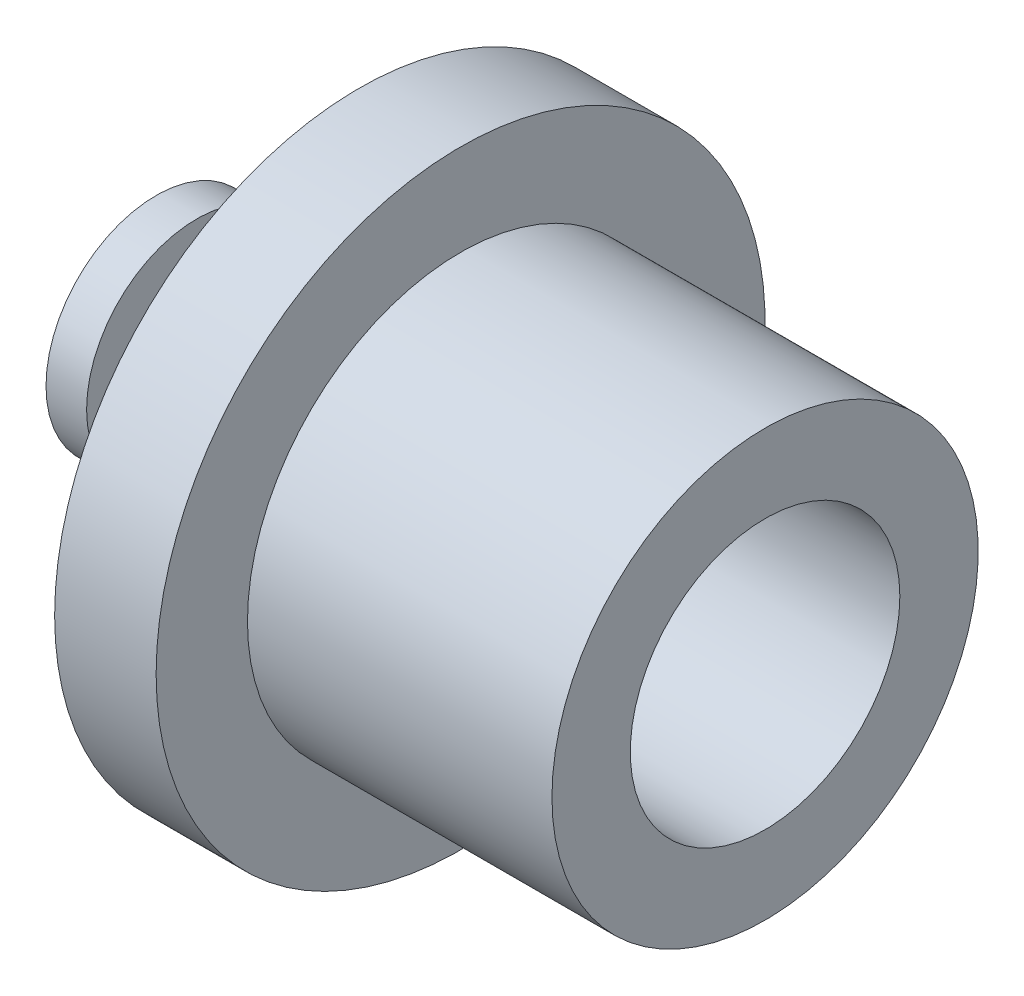
ISO-10303-21;
HEADER;
FILE_DESCRIPTION(('STEP AP214'),'2;1');
FILE_NAME('part.step','',(''),(''),'','','');
FILE_SCHEMA(('AUTOMOTIVE_DESIGN { 1 0 10303 214 1 1 1 1 }'));
ENDSEC;
DATA;
#1=APPLICATION_CONTEXT('core data for automotive mechanical design processes');
#2=APPLICATION_PROTOCOL_DEFINITION('international standard','automotive_design',2000,#1);
#3=PRODUCT_CONTEXT('',#1,'mechanical');
#4=PRODUCT('Part','Part','',(#3));
#5=PRODUCT_RELATED_PRODUCT_CATEGORY('part','',(#4));
#6=PRODUCT_DEFINITION_FORMATION('','',#4);
#7=PRODUCT_DEFINITION_CONTEXT('part definition',#1,'design');
#8=PRODUCT_DEFINITION('design','',#6,#7);
#9=PRODUCT_DEFINITION_SHAPE('','',#8);
#10=(LENGTH_UNIT() NAMED_UNIT(*) SI_UNIT(.MILLI.,.METRE.));
#11=(NAMED_UNIT(*) PLANE_ANGLE_UNIT() SI_UNIT($,.RADIAN.));
#12=(NAMED_UNIT(*) SI_UNIT($,.STERADIAN.) SOLID_ANGLE_UNIT());
#13=UNCERTAINTY_MEASURE_WITH_UNIT(LENGTH_MEASURE(1.E-05),#10,'distance_accuracy_value','');
#14=(GEOMETRIC_REPRESENTATION_CONTEXT(3) GLOBAL_UNCERTAINTY_ASSIGNED_CONTEXT((#13)) GLOBAL_UNIT_ASSIGNED_CONTEXT((#10,
#11,#12)) REPRESENTATION_CONTEXT('',''));
#15=CARTESIAN_POINT('',(0.,0.,0.));
#16=DIRECTION('',(0.,0.,1.));
#17=DIRECTION('',(1.,0.,0.));
#18=AXIS2_PLACEMENT_3D('',#15,#16,#17);
#19=CARTESIAN_POINT('',(1.27,3.444875,0.));
#20=DIRECTION('',(-1.,0.,0.));
#21=DIRECTION('',(0.,0.,1.));
#22=AXIS2_PLACEMENT_3D('',#19,#20,#21);
#23=PLANE('',#22);
#24=CARTESIAN_POINT('',(1.27,0.,0.));
#25=DIRECTION('',(-1.,0.,0.));
#26=DIRECTION('',(0.,0.,1.));
#27=AXIS2_PLACEMENT_3D('',#24,#25,#26);
#28=CIRCLE('',#27,3.444875);
#29=CARTESIAN_POINT('',(1.27,0.,3.444875));
#30=VERTEX_POINT('',#29);
#31=EDGE_CURVE('E10',#30,#30,#28,.T.);
#32=ORIENTED_EDGE('',*,*,#31,.F.);
#33=EDGE_LOOP('',(#32));
#34=FACE_BOUND('',#33,.T.);
#35=CARTESIAN_POINT('',(1.27,0.,0.));
#36=DIRECTION('',(-1.,0.,0.));
#37=DIRECTION('',(0.,0.,1.));
#38=AXIS2_PLACEMENT_3D('',#35,#36,#37);
#39=CIRCLE('',#38,2.073275);
#40=CARTESIAN_POINT('',(1.27,0.,2.073275));
#41=VERTEX_POINT('',#40);
#42=EDGE_CURVE('E73',#41,#41,#39,.T.);
#43=ORIENTED_EDGE('',*,*,#42,.T.);
#44=EDGE_LOOP('',(#43));
#45=FACE_BOUND('',#44,.T.);
#46=ADVANCED_FACE('F39',(#34,#45),#23,.F.);
#47=CARTESIAN_POINT('',(0.,0.,0.));
#48=DIRECTION('',(-1.,0.,0.));
#49=DIRECTION('',(0.,0.,1.));
#50=AXIS2_PLACEMENT_3D('',#47,#48,#49);
#51=CYLINDRICAL_SURFACE('',#50,3.444875);
#52=CARTESIAN_POINT('',(0.,0.,0.));
#53=DIRECTION('',(-1.,0.,0.));
#54=DIRECTION('',(0.,0.,1.));
#55=AXIS2_PLACEMENT_3D('',#52,#53,#54);
#56=CIRCLE('',#55,3.444875);
#57=CARTESIAN_POINT('',(0.,0.,3.444875));
#58=VERTEX_POINT('',#57);
#59=EDGE_CURVE('E46',#58,#58,#56,.T.);
#60=ORIENTED_EDGE('',*,*,#59,.F.);
#61=EDGE_LOOP('',(#60));
#62=FACE_BOUND('',#61,.T.);
#63=ORIENTED_EDGE('',*,*,#31,.T.);
#64=EDGE_LOOP('',(#63));
#65=FACE_BOUND('',#64,.T.);
#66=ADVANCED_FACE('F103',(#62,#65),#51,.T.);
#67=CARTESIAN_POINT('',(0.,0.,0.));
#68=DIRECTION('',(1.,0.,0.));
#69=DIRECTION('',(0.,0.,-1.));
#70=AXIS2_PLACEMENT_3D('',#67,#68,#69);
#71=PLANE('',#70);
#72=CARTESIAN_POINT('',(0.,0.,0.));
#73=DIRECTION('',(-1.,0.,0.));
#74=DIRECTION('',(0.,0.,1.));
#75=AXIS2_PLACEMENT_3D('',#72,#73,#74);
#76=CIRCLE('',#75,1.19062499999999);
#77=CARTESIAN_POINT('',(0.,0.,1.19062499999999));
#78=VERTEX_POINT('',#77);
#79=EDGE_CURVE('E82',#78,#78,#76,.T.);
#80=ORIENTED_EDGE('',*,*,#79,.F.);
#81=EDGE_LOOP('',(#80));
#82=FACE_BOUND('',#81,.T.);
#83=ORIENTED_EDGE('',*,*,#59,.T.);
#84=EDGE_LOOP('',(#83));
#85=FACE_BOUND('',#84,.T.);
#86=ADVANCED_FACE('F108',(#82,#85),#71,.F.);
#87=CARTESIAN_POINT('',(19.05,6.6675,0.));
#88=DIRECTION('',(-1.,0.,0.));
#89=DIRECTION('',(0.,0.,1.));
#90=AXIS2_PLACEMENT_3D('',#87,#88,#89);
#91=PLANE('',#90);
#92=CARTESIAN_POINT('',(19.05,0.,0.));
#93=DIRECTION('',(1.,0.,0.));
#94=DIRECTION('',(0.,0.,-1.));
#95=AXIS2_PLACEMENT_3D('',#92,#93,#94);
#96=CIRCLE('',#95,4.21639999999999);
#97=CARTESIAN_POINT('',(19.05,0.,-4.21639999999999));
#98=VERTEX_POINT('',#97);
#99=EDGE_CURVE('E79',#98,#98,#96,.T.);
#100=ORIENTED_EDGE('',*,*,#99,.F.);
#101=EDGE_LOOP('',(#100));
#102=FACE_BOUND('',#101,.T.);
#103=CARTESIAN_POINT('',(19.05,0.,0.));
#104=DIRECTION('',(-1.,0.,0.));
#105=DIRECTION('',(0.,0.,1.));
#106=AXIS2_PLACEMENT_3D('',#103,#104,#105);
#107=CIRCLE('',#106,6.6675);
#108=CARTESIAN_POINT('',(19.05,0.,6.6675));
#109=VERTEX_POINT('',#108);
#110=EDGE_CURVE('E50',#109,#109,#107,.T.);
#111=ORIENTED_EDGE('',*,*,#110,.F.);
#112=EDGE_LOOP('',(#111));
#113=FACE_BOUND('',#112,.T.);
#114=ADVANCED_FACE('F152',(#102,#113),#91,.F.);
#115=CARTESIAN_POINT('',(0.,0.,0.));
#116=DIRECTION('',(-1.,0.,0.));
#117=DIRECTION('',(0.,0.,1.));
#118=AXIS2_PLACEMENT_3D('',#115,#116,#117);
#119=CYLINDRICAL_SURFACE('',#118,6.6675);
#120=CARTESIAN_POINT('',(9.525,0.,0.));
#121=DIRECTION('',(-1.,0.,0.));
#122=DIRECTION('',(0.,0.,1.));
#123=AXIS2_PLACEMENT_3D('',#120,#121,#122);
#124=CIRCLE('',#123,6.6675);
#125=CARTESIAN_POINT('',(9.525,0.,6.6675));
#126=VERTEX_POINT('',#125);
#127=EDGE_CURVE('E55',#126,#126,#124,.T.);
#128=ORIENTED_EDGE('',*,*,#127,.F.);
#129=EDGE_LOOP('',(#128));
#130=FACE_BOUND('',#129,.T.);
#131=ORIENTED_EDGE('',*,*,#110,.T.);
#132=EDGE_LOOP('',(#131));
#133=FACE_BOUND('',#132,.T.);
#134=ADVANCED_FACE('F146',(#130,#133),#119,.T.);
#135=CARTESIAN_POINT('',(9.525,9.525,0.));
#136=DIRECTION('',(-1.,0.,0.));
#137=DIRECTION('',(0.,0.,1.));
#138=AXIS2_PLACEMENT_3D('',#135,#136,#137);
#139=PLANE('',#138);
#140=CARTESIAN_POINT('',(9.525,0.,0.));
#141=DIRECTION('',(-1.,0.,0.));
#142=DIRECTION('',(0.,0.,1.));
#143=AXIS2_PLACEMENT_3D('',#140,#141,#142);
#144=CIRCLE('',#143,9.525);
#145=CARTESIAN_POINT('',(9.525,0.,9.525));
#146=VERTEX_POINT('',#145);
#147=EDGE_CURVE('E58',#146,#146,#144,.T.);
#148=ORIENTED_EDGE('',*,*,#147,.F.);
#149=EDGE_LOOP('',(#148));
#150=FACE_BOUND('',#149,.T.);
#151=ORIENTED_EDGE('',*,*,#127,.T.);
#152=EDGE_LOOP('',(#151));
#153=FACE_BOUND('',#152,.T.);
#154=ADVANCED_FACE('F140',(#150,#153),#139,.F.);
#155=CARTESIAN_POINT('',(0.,0.,0.));
#156=DIRECTION('',(-1.,0.,0.));
#157=DIRECTION('',(0.,0.,1.));
#158=AXIS2_PLACEMENT_3D('',#155,#156,#157);
#159=CYLINDRICAL_SURFACE('',#158,9.525);
#160=CARTESIAN_POINT('',(6.35,0.,0.));
#161=DIRECTION('',(-1.,0.,0.));
#162=DIRECTION('',(0.,0.,1.));
#163=AXIS2_PLACEMENT_3D('',#160,#161,#162);
#164=CIRCLE('',#163,9.525);
#165=CARTESIAN_POINT('',(6.35,0.,9.525));
#166=VERTEX_POINT('',#165);
#167=EDGE_CURVE('E61',#166,#166,#164,.T.);
#168=ORIENTED_EDGE('',*,*,#167,.F.);
#169=EDGE_LOOP('',(#168));
#170=FACE_BOUND('',#169,.T.);
#171=ORIENTED_EDGE('',*,*,#147,.T.);
#172=EDGE_LOOP('',(#171));
#173=FACE_BOUND('',#172,.T.);
#174=ADVANCED_FACE('F134',(#170,#173),#159,.T.);
#175=CARTESIAN_POINT('',(6.35,3.444875,0.));
#176=DIRECTION('',(1.,0.,0.));
#177=DIRECTION('',(0.,0.,-1.));
#178=AXIS2_PLACEMENT_3D('',#175,#176,#177);
#179=PLANE('',#178);
#180=CARTESIAN_POINT('',(6.35,0.,0.));
#181=DIRECTION('',(-1.,0.,0.));
#182=DIRECTION('',(0.,0.,1.));
#183=AXIS2_PLACEMENT_3D('',#180,#181,#182);
#184=CIRCLE('',#183,3.444875);
#185=CARTESIAN_POINT('',(6.35,0.,3.444875));
#186=VERTEX_POINT('',#185);
#187=EDGE_CURVE('E64',#186,#186,#184,.T.);
#188=ORIENTED_EDGE('',*,*,#187,.F.);
#189=EDGE_LOOP('',(#188));
#190=FACE_BOUND('',#189,.T.);
#191=ORIENTED_EDGE('',*,*,#167,.T.);
#192=EDGE_LOOP('',(#191));
#193=FACE_BOUND('',#192,.T.);
#194=ADVANCED_FACE('F128',(#190,#193),#179,.F.);
#195=CARTESIAN_POINT('',(0.,0.,0.));
#196=DIRECTION('',(-1.,0.,0.));
#197=DIRECTION('',(0.,0.,1.));
#198=AXIS2_PLACEMENT_3D('',#195,#196,#197);
#199=CYLINDRICAL_SURFACE('',#198,3.444875);
#200=CARTESIAN_POINT('',(3.81,0.,0.));
#201=DIRECTION('',(-1.,0.,0.));
#202=DIRECTION('',(0.,0.,1.));
#203=AXIS2_PLACEMENT_3D('',#200,#201,#202);
#204=CIRCLE('',#203,3.444875);
#205=CARTESIAN_POINT('',(3.81,0.,3.444875));
#206=VERTEX_POINT('',#205);
#207=EDGE_CURVE('E67',#206,#206,#204,.T.);
#208=ORIENTED_EDGE('',*,*,#207,.F.);
#209=EDGE_LOOP('',(#208));
#210=FACE_BOUND('',#209,.T.);
#211=ORIENTED_EDGE('',*,*,#187,.T.);
#212=EDGE_LOOP('',(#211));
#213=FACE_BOUND('',#212,.T.);
#214=ADVANCED_FACE('F122',(#210,#213),#199,.T.);
#215=CARTESIAN_POINT('',(3.81,3.444875,0.));
#216=DIRECTION('',(1.,0.,0.));
#217=DIRECTION('',(0.,0.,-1.));
#218=AXIS2_PLACEMENT_3D('',#215,#216,#217);
#219=PLANE('',#218);
#220=CARTESIAN_POINT('',(3.81,0.,0.));
#221=DIRECTION('',(-1.,0.,0.));
#222=DIRECTION('',(0.,0.,1.));
#223=AXIS2_PLACEMENT_3D('',#220,#221,#222);
#224=CIRCLE('',#223,2.073275);
#225=CARTESIAN_POINT('',(3.81,0.,2.073275));
#226=VERTEX_POINT('',#225);
#227=EDGE_CURVE('E70',#226,#226,#224,.T.);
#228=ORIENTED_EDGE('',*,*,#227,.F.);
#229=EDGE_LOOP('',(#228));
#230=FACE_BOUND('',#229,.T.);
#231=ORIENTED_EDGE('',*,*,#207,.T.);
#232=EDGE_LOOP('',(#231));
#233=FACE_BOUND('',#232,.T.);
#234=ADVANCED_FACE('F116',(#230,#233),#219,.F.);
#235=CARTESIAN_POINT('',(0.,0.,0.));
#236=DIRECTION('',(-1.,0.,0.));
#237=DIRECTION('',(0.,0.,1.));
#238=AXIS2_PLACEMENT_3D('',#235,#236,#237);
#239=CYLINDRICAL_SURFACE('',#238,2.073275);
#240=ORIENTED_EDGE('',*,*,#42,.F.);
#241=EDGE_LOOP('',(#240));
#242=FACE_BOUND('',#241,.T.);
#243=ORIENTED_EDGE('',*,*,#227,.T.);
#244=EDGE_LOOP('',(#243));
#245=FACE_BOUND('',#244,.T.);
#246=ADVANCED_FACE('F113',(#242,#245),#239,.T.);
#247=CARTESIAN_POINT('',(9.525,0.,0.));
#248=DIRECTION('',(1.,0.,0.));
#249=DIRECTION('',(0.,0.,-1.));
#250=AXIS2_PLACEMENT_3D('',#247,#248,#249);
#251=CONICAL_SURFACE('',#250,4.2164,1.02974425867665);
#252=CARTESIAN_POINT('',(7.70693096046188,0.,0.));
#253=DIRECTION('',(1.,0.,0.));
#254=DIRECTION('',(0.,0.,-1.));
#255=AXIS2_PLACEMENT_3D('',#252,#253,#254);
#256=CIRCLE('',#255,1.19062499999999);
#257=CARTESIAN_POINT('',(7.70693096046188,0.,-1.19062499999999));
#258=VERTEX_POINT('',#257);
#259=EDGE_CURVE('E42',#258,#258,#256,.F.);
#260=CARTESIAN_POINT('',(9.525,0.,0.));
#261=DIRECTION('',(1.,0.,0.));
#262=DIRECTION('',(0.,0.,-1.));
#263=AXIS2_PLACEMENT_3D('',#260,#261,#262);
#264=CIRCLE('',#263,4.2164);
#265=CARTESIAN_POINT('',(9.525,0.,-4.21639999999999));
#266=VERTEX_POINT('',#265);
#267=EDGE_CURVE('E76',#266,#266,#264,.T.);
#268=CARTESIAN_POINT('',(7.70693096046188,0.,-1.19062499999999));
#269=CARTESIAN_POINT('',(7.72586917962373,0.,-1.22214348958332));
#270=CARTESIAN_POINT('',(7.74480739878559,0.,-1.25366197916666));
#271=CARTESIAN_POINT('',(7.7826838371093,0.,-1.31669895833332));
#272=CARTESIAN_POINT('',(7.80162205627115,0.,-1.34821744791666));
#273=CARTESIAN_POINT('',(7.83949849459486,0.,-1.41125442708332));
#274=CARTESIAN_POINT('',(7.85843671375672,0.,-1.44277291666666));
#275=CARTESIAN_POINT('',(7.89631315208043,0.,-1.50580989583332));
#276=CARTESIAN_POINT('',(7.91525137124229,0.,-1.53732838541666));
#277=CARTESIAN_POINT('',(7.953127809566,0.,-1.60036536458332));
#278=CARTESIAN_POINT('',(7.97206602872785,0.,-1.63188385416666));
#279=CARTESIAN_POINT('',(8.00994246705156,0.,-1.69492083333332));
#280=CARTESIAN_POINT('',(8.02888068621342,0.,-1.72643932291666));
#281=CARTESIAN_POINT('',(8.06675712453713,0.,-1.78947630208333));
#282=CARTESIAN_POINT('',(8.08569534369899,0.,-1.82099479166666));
#283=CARTESIAN_POINT('',(8.1235717820227,0.,-1.88403177083332));
#284=CARTESIAN_POINT('',(8.14251000118455,0.,-1.91555026041666));
#285=CARTESIAN_POINT('',(8.18038643950826,0.,-1.97858723958333));
#286=CARTESIAN_POINT('',(8.19932465867012,0.,-2.01010572916666));
#287=CARTESIAN_POINT('',(8.23720109699383,0.,-2.07314270833333));
#288=CARTESIAN_POINT('',(8.25613931615568,0.,-2.10466119791666));
#289=CARTESIAN_POINT('',(8.29401575447939,0.,-2.16769817708333));
#290=CARTESIAN_POINT('',(8.31295397364125,0.,-2.19921666666666));
#291=CARTESIAN_POINT('',(8.35083041196496,0.,-2.26225364583333));
#292=CARTESIAN_POINT('',(8.36976863112682,0.,-2.29377213541666));
#293=CARTESIAN_POINT('',(8.40764506945053,0.,-2.35680911458333));
#294=CARTESIAN_POINT('',(8.42658328861238,0.,-2.38832760416666));
#295=CARTESIAN_POINT('',(8.46445972693609,0.,-2.45136458333333));
#296=CARTESIAN_POINT('',(8.48339794609795,0.,-2.48288307291666));
#297=CARTESIAN_POINT('',(8.52127438442166,0.,-2.54592005208333));
#298=CARTESIAN_POINT('',(8.54021260358351,0.,-2.57743854166666));
#299=CARTESIAN_POINT('',(8.57808904190722,0.,-2.64047552083333));
#300=CARTESIAN_POINT('',(8.59702726106908,0.,-2.67199401041666));
#301=CARTESIAN_POINT('',(8.63490369939279,0.,-2.73503098958333));
#302=CARTESIAN_POINT('',(8.65384191855465,0.,-2.76654947916666));
#303=CARTESIAN_POINT('',(8.69171835687836,0.,-2.82958645833333));
#304=CARTESIAN_POINT('',(8.71065657604021,0.,-2.86110494791666));
#305=CARTESIAN_POINT('',(8.74853301436392,0.,-2.92414192708333));
#306=CARTESIAN_POINT('',(8.76747123352578,0.,-2.95566041666666));
#307=CARTESIAN_POINT('',(8.80534767184949,0.,-3.01869739583333));
#308=CARTESIAN_POINT('',(8.82428589101135,0.,-3.05021588541666));
#309=CARTESIAN_POINT('',(8.86216232933506,0.,-3.11325286458333));
#310=CARTESIAN_POINT('',(8.88110054849691,0.,-3.14477135416666));
#311=CARTESIAN_POINT('',(8.91897698682062,0.,-3.20780833333333));
#312=CARTESIAN_POINT('',(8.93791520598248,0.,-3.23932682291666));
#313=CARTESIAN_POINT('',(8.97579164430619,0.,-3.30236380208333));
#314=CARTESIAN_POINT('',(8.99472986346805,0.,-3.33388229166666));
#315=CARTESIAN_POINT('',(9.03260630179176,0.,-3.39691927083333));
#316=CARTESIAN_POINT('',(9.05154452095361,0.,-3.42843776041666));
#317=CARTESIAN_POINT('',(9.08942095927732,0.,-3.49147473958333));
#318=CARTESIAN_POINT('',(9.10835917843918,0.,-3.52299322916666));
#319=CARTESIAN_POINT('',(9.14623561676289,0.,-3.58603020833333));
#320=CARTESIAN_POINT('',(9.16517383592474,0.,-3.61754869791666));
#321=CARTESIAN_POINT('',(9.20305027424845,0.,-3.68058567708333));
#322=CARTESIAN_POINT('',(9.22198849341031,0.,-3.71210416666666));
#323=CARTESIAN_POINT('',(9.25986493173402,0.,-3.77514114583333));
#324=CARTESIAN_POINT('',(9.27880315089588,0.,-3.80665963541666));
#325=CARTESIAN_POINT('',(9.31667958921959,0.,-3.86969661458333));
#326=CARTESIAN_POINT('',(9.33561780838144,0.,-3.90121510416666));
#327=CARTESIAN_POINT('',(9.37349424670515,0.,-3.96425208333333));
#328=CARTESIAN_POINT('',(9.39243246586701,0.,-3.99577057291666));
#329=CARTESIAN_POINT('',(9.43030890419072,0.,-4.05880755208333));
#330=CARTESIAN_POINT('',(9.44924712335258,0.,-4.09032604166666));
#331=CARTESIAN_POINT('',(9.48712356167629,0.,-4.15336302083333));
#332=CARTESIAN_POINT('',(9.50606178083814,0.,-4.18488151041666));
#333=CARTESIAN_POINT('',(9.525,0.,-4.21639999999999));
#334=B_SPLINE_CURVE_WITH_KNOTS('',3,(#268,#269,#270,#271,#272,#273,#274,#275,#276,#277,#278,
#279,#280,#281,#282,#283,#284,#285,#286,#287,#288,#289,#290,#291,#292,#293,#294,#295,#296,#297,
#298,#299,#300,#301,#302,#303,#304,#305,#306,#307,#308,#309,#310,#311,#312,#313,#314,#315,#316,
#317,#318,#319,#320,#321,#322,#323,#324,#325,#326,#327,#328,#329,#330,#331,#332,#333),
.UNSPECIFIED.,.F.,.F.,(4,2,2,2,2,2,2,2,2,2,2,2,2,2,2,2,2,2,2,2,2,2,2,2,2,2,2,2,2,2,2,2,4),(0.,
0.110311567733101,0.220623135466201,0.330934703199302,0.441246270932403,0.551557838665504,
0.661869406398604,0.772180974131706,0.882492541864805,0.992804109597907,1.10311567733101,
1.21342724506411,1.32373881279721,1.43405038053031,1.54436194826341,1.65467351599651,
1.76498508372961,1.87529665146271,1.98560821919581,2.09591978692891,2.20623135466202,
2.31654292239512,2.42685449012822,2.53716605786132,2.64747762559442,2.75778919332752,
2.86810076106062,2.97841232879372,3.08872389652682,3.19903546425992,3.30934703199302,
3.41965859972612,3.52997016745922),.UNSPECIFIED.);
#335=EDGE_CURVE('BSEAM89',#258,#266,#334,.T.);
#336=ORIENTED_EDGE('',*,*,#259,.T.);
#337=ORIENTED_EDGE('',*,*,#267,.T.);
#338=ORIENTED_EDGE('',*,*,#335,.T.);
#339=ORIENTED_EDGE('',*,*,#335,.F.);
#340=EDGE_LOOP('',(#336,#338,#337,#339));
#341=FACE_BOUND('',#340,.T.);
#342=ADVANCED_FACE('F89',(#341),#251,.F.);
#343=CARTESIAN_POINT('',(19.05,0.,0.));
#344=DIRECTION('',(1.,0.,0.));
#345=DIRECTION('',(0.,0.,-1.));
#346=AXIS2_PLACEMENT_3D('',#343,#344,#345);
#347=CYLINDRICAL_SURFACE('',#346,4.21639999999999);
#348=ORIENTED_EDGE('',*,*,#267,.F.);
#349=EDGE_LOOP('',(#348));
#350=FACE_BOUND('',#349,.T.);
#351=ORIENTED_EDGE('',*,*,#99,.T.);
#352=EDGE_LOOP('',(#351));
#353=FACE_BOUND('',#352,.T.);
#354=ADVANCED_FACE('F94',(#350,#353),#347,.F.);
#355=CARTESIAN_POINT('',(0.,0.,0.));
#356=DIRECTION('',(-1.,0.,0.));
#357=DIRECTION('',(0.,0.,1.));
#358=AXIS2_PLACEMENT_3D('',#355,#356,#357);
#359=CYLINDRICAL_SURFACE('',#358,1.19062499999999);
#360=ORIENTED_EDGE('',*,*,#79,.T.);
#361=EDGE_LOOP('',(#360));
#362=FACE_BOUND('',#361,.T.);
#363=ORIENTED_EDGE('',*,*,#259,.F.);
#364=EDGE_LOOP('',(#363));
#365=FACE_BOUND('',#364,.T.);
#366=ADVANCED_FACE('F92',(#362,#365),#359,.F.);
#367=CLOSED_SHELL('',(#46,#66,#86,#114,#134,#154,#174,#194,#214,#234,#246,#342,#354,#366));
#368=MANIFOLD_SOLID_BREP('B2',#367);
#369=ADVANCED_BREP_SHAPE_REPRESENTATION('',(#18,#368),#14);
#370=SHAPE_DEFINITION_REPRESENTATION(#9,#369);
ENDSEC;
END-ISO-10303-21;
